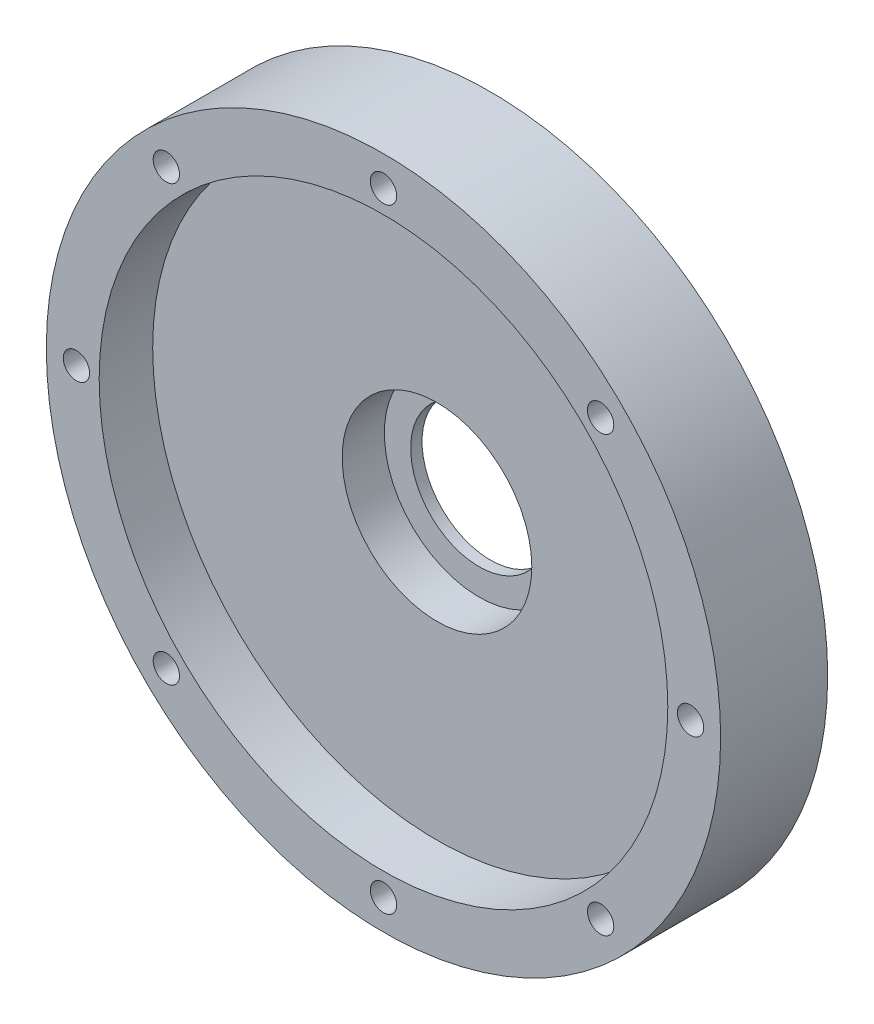
ISO-10303-21;
HEADER;
FILE_DESCRIPTION(('STEP AP214'),'2;1');
FILE_NAME('part.step','',(''),(''),'','','');
FILE_SCHEMA(('AUTOMOTIVE_DESIGN { 1 0 10303 214 1 1 1 1 }'));
ENDSEC;
DATA;
#1=APPLICATION_CONTEXT('core data for automotive mechanical design processes');
#2=APPLICATION_PROTOCOL_DEFINITION('international standard','automotive_design',2000,#1);
#3=PRODUCT_CONTEXT('',#1,'mechanical');
#4=PRODUCT('Part','Part','',(#3));
#5=PRODUCT_RELATED_PRODUCT_CATEGORY('part','',(#4));
#6=PRODUCT_DEFINITION_FORMATION('','',#4);
#7=PRODUCT_DEFINITION_CONTEXT('part definition',#1,'design');
#8=PRODUCT_DEFINITION('design','',#6,#7);
#9=PRODUCT_DEFINITION_SHAPE('','',#8);
#10=(LENGTH_UNIT() NAMED_UNIT(*) SI_UNIT(.MILLI.,.METRE.));
#11=(NAMED_UNIT(*) PLANE_ANGLE_UNIT() SI_UNIT($,.RADIAN.));
#12=(NAMED_UNIT(*) SI_UNIT($,.STERADIAN.) SOLID_ANGLE_UNIT());
#13=UNCERTAINTY_MEASURE_WITH_UNIT(LENGTH_MEASURE(1.E-05),#10,'distance_accuracy_value','');
#14=(GEOMETRIC_REPRESENTATION_CONTEXT(3) GLOBAL_UNCERTAINTY_ASSIGNED_CONTEXT((#13)) GLOBAL_UNIT_ASSIGNED_CONTEXT((#10,
#11,#12)) REPRESENTATION_CONTEXT('',''));
#15=CARTESIAN_POINT('',(0.,0.,0.));
#16=DIRECTION('',(0.,0.,1.));
#17=DIRECTION('',(1.,0.,0.));
#18=AXIS2_PLACEMENT_3D('',#15,#16,#17);
#19=CARTESIAN_POINT('',(0.,0.,10.16));
#20=DIRECTION('',(0.,0.,-1.));
#21=DIRECTION('',(-1.,0.,0.));
#22=AXIS2_PLACEMENT_3D('',#19,#20,#21);
#23=CYLINDRICAL_SURFACE('',#22,32.004);
#24=CARTESIAN_POINT('',(0.,0.,10.16));
#25=DIRECTION('',(0.,0.,1.));
#26=DIRECTION('',(1.,0.,0.));
#27=AXIS2_PLACEMENT_3D('',#24,#25,#26);
#28=CIRCLE('',#27,32.004);
#29=CARTESIAN_POINT('',(32.004,0.,10.16));
#30=VERTEX_POINT('',#29);
#31=EDGE_CURVE('E10',#30,#30,#28,.T.);
#32=ORIENTED_EDGE('',*,*,#31,.F.);
#33=EDGE_LOOP('',(#32));
#34=FACE_BOUND('',#33,.T.);
#35=CARTESIAN_POINT('',(0.,0.,0.));
#36=DIRECTION('',(0.,0.,1.));
#37=DIRECTION('',(1.,0.,0.));
#38=AXIS2_PLACEMENT_3D('',#35,#36,#37);
#39=CIRCLE('',#38,32.004);
#40=CARTESIAN_POINT('',(32.004,0.,0.));
#41=VERTEX_POINT('',#40);
#42=EDGE_CURVE('E50',#41,#41,#39,.T.);
#43=ORIENTED_EDGE('',*,*,#42,.T.);
#44=EDGE_LOOP('',(#43));
#45=FACE_BOUND('',#44,.T.);
#46=ADVANCED_FACE('F47',(#34,#45),#23,.T.);
#47=CARTESIAN_POINT('',(0.,0.,10.16));
#48=DIRECTION('',(0.,0.,1.));
#49=DIRECTION('',(1.,0.,0.));
#50=AXIS2_PLACEMENT_3D('',#47,#48,#49);
#51=PLANE('',#50);
#52=CARTESIAN_POINT('',(0.,29.1465,10.16));
#53=DIRECTION('',(0.,0.,1.));
#54=DIRECTION('',(1.,0.,0.));
#55=AXIS2_PLACEMENT_3D('',#52,#53,#54);
#56=CIRCLE('',#55,1.24999999999999);
#57=CARTESIAN_POINT('',(1.24999999999999,29.1465,10.16));
#58=VERTEX_POINT('',#57);
#59=EDGE_CURVE('E144',#58,#58,#56,.T.);
#60=ORIENTED_EDGE('',*,*,#59,.F.);
#61=EDGE_LOOP('',(#60));
#62=FACE_BOUND('',#61,.T.);
#63=CARTESIAN_POINT('',(20.6096877978537,20.6096877978537,10.16));
#64=DIRECTION('',(0.,0.,1.));
#65=DIRECTION('',(1.,0.,0.));
#66=AXIS2_PLACEMENT_3D('',#63,#64,#65);
#67=CIRCLE('',#66,1.24999999999999);
#68=CARTESIAN_POINT('',(21.8596877978537,20.6096877978537,10.16));
#69=VERTEX_POINT('',#68);
#70=EDGE_CURVE('E136',#69,#69,#67,.T.);
#71=ORIENTED_EDGE('',*,*,#70,.F.);
#72=EDGE_LOOP('',(#71));
#73=FACE_BOUND('',#72,.T.);
#74=CARTESIAN_POINT('',(29.1465,0.,10.16));
#75=DIRECTION('',(0.,0.,1.));
#76=DIRECTION('',(1.,0.,0.));
#77=AXIS2_PLACEMENT_3D('',#74,#75,#76);
#78=CIRCLE('',#77,1.24999999999999);
#79=CARTESIAN_POINT('',(30.3965,0.,10.16));
#80=VERTEX_POINT('',#79);
#81=EDGE_CURVE('E128',#80,#80,#78,.T.);
#82=ORIENTED_EDGE('',*,*,#81,.F.);
#83=EDGE_LOOP('',(#82));
#84=FACE_BOUND('',#83,.T.);
#85=CARTESIAN_POINT('',(20.6096877978537,-20.6096877978537,10.16));
#86=DIRECTION('',(0.,0.,1.));
#87=DIRECTION('',(1.,0.,0.));
#88=AXIS2_PLACEMENT_3D('',#85,#86,#87);
#89=CIRCLE('',#88,1.24999999999999);
#90=CARTESIAN_POINT('',(21.8596877978537,-20.6096877978537,10.16));
#91=VERTEX_POINT('',#90);
#92=EDGE_CURVE('E120',#91,#91,#89,.T.);
#93=ORIENTED_EDGE('',*,*,#92,.F.);
#94=EDGE_LOOP('',(#93));
#95=FACE_BOUND('',#94,.T.);
#96=CARTESIAN_POINT('',(0.,-29.1465,10.16));
#97=DIRECTION('',(0.,0.,1.));
#98=DIRECTION('',(1.,0.,0.));
#99=AXIS2_PLACEMENT_3D('',#96,#97,#98);
#100=CIRCLE('',#99,1.24999999999999);
#101=CARTESIAN_POINT('',(1.24999999999999,-29.1465,10.16));
#102=VERTEX_POINT('',#101);
#103=EDGE_CURVE('E112',#102,#102,#100,.T.);
#104=ORIENTED_EDGE('',*,*,#103,.F.);
#105=EDGE_LOOP('',(#104));
#106=FACE_BOUND('',#105,.T.);
#107=CARTESIAN_POINT('',(-20.6096877978537,-20.6096877978537,10.16));
#108=DIRECTION('',(0.,0.,1.));
#109=DIRECTION('',(1.,0.,0.));
#110=AXIS2_PLACEMENT_3D('',#107,#108,#109);
#111=CIRCLE('',#110,1.24999999999999);
#112=CARTESIAN_POINT('',(-19.3596877978537,-20.6096877978537,10.16));
#113=VERTEX_POINT('',#112);
#114=EDGE_CURVE('E104',#113,#113,#111,.T.);
#115=ORIENTED_EDGE('',*,*,#114,.F.);
#116=EDGE_LOOP('',(#115));
#117=FACE_BOUND('',#116,.T.);
#118=CARTESIAN_POINT('',(-29.1465,0.,10.16));
#119=DIRECTION('',(0.,0.,1.));
#120=DIRECTION('',(1.,0.,0.));
#121=AXIS2_PLACEMENT_3D('',#118,#119,#120);
#122=CIRCLE('',#121,1.24999999999999);
#123=CARTESIAN_POINT('',(-27.8965,0.,10.16));
#124=VERTEX_POINT('',#123);
#125=EDGE_CURVE('E96',#124,#124,#122,.T.);
#126=ORIENTED_EDGE('',*,*,#125,.F.);
#127=EDGE_LOOP('',(#126));
#128=FACE_BOUND('',#127,.T.);
#129=CARTESIAN_POINT('',(-20.6096877978537,20.6096877978537,10.16));
#130=DIRECTION('',(0.,0.,1.));
#131=DIRECTION('',(1.,0.,0.));
#132=AXIS2_PLACEMENT_3D('',#129,#130,#131);
#133=CIRCLE('',#132,1.24999999999999);
#134=CARTESIAN_POINT('',(-19.3596877978537,20.6096877978537,10.16));
#135=VERTEX_POINT('',#134);
#136=EDGE_CURVE('E88',#135,#135,#133,.T.);
#137=ORIENTED_EDGE('',*,*,#136,.F.);
#138=EDGE_LOOP('',(#137));
#139=FACE_BOUND('',#138,.T.);
#140=CARTESIAN_POINT('',(0.,0.,10.16));
#141=DIRECTION('',(0.,0.,1.));
#142=DIRECTION('',(1.,0.,0.));
#143=AXIS2_PLACEMENT_3D('',#140,#141,#142);
#144=CIRCLE('',#143,26.9875);
#145=CARTESIAN_POINT('',(26.9875,0.,10.16));
#146=VERTEX_POINT('',#145);
#147=EDGE_CURVE('E61',#146,#146,#144,.T.);
#148=ORIENTED_EDGE('',*,*,#147,.F.);
#149=EDGE_LOOP('',(#148));
#150=FACE_BOUND('',#149,.T.);
#151=ORIENTED_EDGE('',*,*,#31,.T.);
#152=EDGE_LOOP('',(#151));
#153=FACE_BOUND('',#152,.T.);
#154=ADVANCED_FACE('F151',(#62,#73,#84,#95,#106,#117,#128,#139,#150,#153),#51,.T.);
#155=CARTESIAN_POINT('',(0.,0.,0.));
#156=DIRECTION('',(0.,0.,1.));
#157=DIRECTION('',(1.,0.,0.));
#158=AXIS2_PLACEMENT_3D('',#155,#156,#157);
#159=PLANE('',#158);
#160=CARTESIAN_POINT('',(0.,29.1465,0.));
#161=DIRECTION('',(0.,0.,1.));
#162=DIRECTION('',(1.,0.,0.));
#163=AXIS2_PLACEMENT_3D('',#160,#161,#162);
#164=CIRCLE('',#163,1.25);
#165=CARTESIAN_POINT('',(1.25,29.1465,0.));
#166=VERTEX_POINT('',#165);
#167=EDGE_CURVE('E140',#166,#166,#164,.T.);
#168=ORIENTED_EDGE('',*,*,#167,.T.);
#169=EDGE_LOOP('',(#168));
#170=FACE_BOUND('',#169,.T.);
#171=CARTESIAN_POINT('',(20.6096877978537,20.6096877978537,0.));
#172=DIRECTION('',(0.,0.,1.));
#173=DIRECTION('',(1.,0.,0.));
#174=AXIS2_PLACEMENT_3D('',#171,#172,#173);
#175=CIRCLE('',#174,1.25);
#176=CARTESIAN_POINT('',(21.8596877978537,20.6096877978537,0.));
#177=VERTEX_POINT('',#176);
#178=EDGE_CURVE('E132',#177,#177,#175,.T.);
#179=ORIENTED_EDGE('',*,*,#178,.T.);
#180=EDGE_LOOP('',(#179));
#181=FACE_BOUND('',#180,.T.);
#182=CARTESIAN_POINT('',(29.1465,0.,0.));
#183=DIRECTION('',(0.,0.,1.));
#184=DIRECTION('',(1.,0.,0.));
#185=AXIS2_PLACEMENT_3D('',#182,#183,#184);
#186=CIRCLE('',#185,1.25);
#187=CARTESIAN_POINT('',(30.3965,0.,0.));
#188=VERTEX_POINT('',#187);
#189=EDGE_CURVE('E124',#188,#188,#186,.T.);
#190=ORIENTED_EDGE('',*,*,#189,.T.);
#191=EDGE_LOOP('',(#190));
#192=FACE_BOUND('',#191,.T.);
#193=CARTESIAN_POINT('',(20.6096877978537,-20.6096877978537,0.));
#194=DIRECTION('',(0.,0.,1.));
#195=DIRECTION('',(1.,0.,0.));
#196=AXIS2_PLACEMENT_3D('',#193,#194,#195);
#197=CIRCLE('',#196,1.25);
#198=CARTESIAN_POINT('',(21.8596877978537,-20.6096877978537,0.));
#199=VERTEX_POINT('',#198);
#200=EDGE_CURVE('E116',#199,#199,#197,.T.);
#201=ORIENTED_EDGE('',*,*,#200,.T.);
#202=EDGE_LOOP('',(#201));
#203=FACE_BOUND('',#202,.T.);
#204=CARTESIAN_POINT('',(0.,-29.1465,0.));
#205=DIRECTION('',(0.,0.,1.));
#206=DIRECTION('',(1.,0.,0.));
#207=AXIS2_PLACEMENT_3D('',#204,#205,#206);
#208=CIRCLE('',#207,1.25);
#209=CARTESIAN_POINT('',(1.25,-29.1465,0.));
#210=VERTEX_POINT('',#209);
#211=EDGE_CURVE('E108',#210,#210,#208,.T.);
#212=ORIENTED_EDGE('',*,*,#211,.T.);
#213=EDGE_LOOP('',(#212));
#214=FACE_BOUND('',#213,.T.);
#215=CARTESIAN_POINT('',(-20.6096877978537,-20.6096877978537,0.));
#216=DIRECTION('',(0.,0.,1.));
#217=DIRECTION('',(1.,0.,0.));
#218=AXIS2_PLACEMENT_3D('',#215,#216,#217);
#219=CIRCLE('',#218,1.25);
#220=CARTESIAN_POINT('',(-19.3596877978537,-20.6096877978537,0.));
#221=VERTEX_POINT('',#220);
#222=EDGE_CURVE('E100',#221,#221,#219,.T.);
#223=ORIENTED_EDGE('',*,*,#222,.T.);
#224=EDGE_LOOP('',(#223));
#225=FACE_BOUND('',#224,.T.);
#226=CARTESIAN_POINT('',(-29.1465,0.,0.));
#227=DIRECTION('',(0.,0.,1.));
#228=DIRECTION('',(1.,0.,0.));
#229=AXIS2_PLACEMENT_3D('',#226,#227,#228);
#230=CIRCLE('',#229,1.25);
#231=CARTESIAN_POINT('',(-27.8965,0.,0.));
#232=VERTEX_POINT('',#231);
#233=EDGE_CURVE('E92',#232,#232,#230,.T.);
#234=ORIENTED_EDGE('',*,*,#233,.T.);
#235=EDGE_LOOP('',(#234));
#236=FACE_BOUND('',#235,.T.);
#237=CARTESIAN_POINT('',(-20.6096877978537,20.6096877978537,0.));
#238=DIRECTION('',(0.,0.,1.));
#239=DIRECTION('',(1.,0.,0.));
#240=AXIS2_PLACEMENT_3D('',#237,#238,#239);
#241=CIRCLE('',#240,1.25);
#242=CARTESIAN_POINT('',(-19.3596877978537,20.6096877978537,0.));
#243=VERTEX_POINT('',#242);
#244=EDGE_CURVE('E81',#243,#243,#241,.T.);
#245=ORIENTED_EDGE('',*,*,#244,.T.);
#246=EDGE_LOOP('',(#245));
#247=FACE_BOUND('',#246,.T.);
#248=CARTESIAN_POINT('',(0.,0.,0.));
#249=DIRECTION('',(0.,0.,1.));
#250=DIRECTION('',(1.,0.,0.));
#251=AXIS2_PLACEMENT_3D('',#248,#249,#250);
#252=CIRCLE('',#251,6.5);
#253=CARTESIAN_POINT('',(6.5,0.,0.));
#254=VERTEX_POINT('',#253);
#255=EDGE_CURVE('E73',#254,#254,#252,.T.);
#256=ORIENTED_EDGE('',*,*,#255,.T.);
#257=EDGE_LOOP('',(#256));
#258=FACE_BOUND('',#257,.T.);
#259=ORIENTED_EDGE('',*,*,#42,.F.);
#260=EDGE_LOOP('',(#259));
#261=FACE_BOUND('',#260,.T.);
#262=ADVANCED_FACE('F154',(#170,#181,#192,#203,#214,#225,#236,#247,#258,#261),#159,.F.);
#263=CARTESIAN_POINT('',(0.,0.,5.08));
#264=DIRECTION('',(0.,0.,1.));
#265=DIRECTION('',(1.,0.,0.));
#266=AXIS2_PLACEMENT_3D('',#263,#264,#265);
#267=CYLINDRICAL_SURFACE('',#266,26.9875);
#268=CARTESIAN_POINT('',(0.,0.,5.08));
#269=DIRECTION('',(0.,0.,1.));
#270=DIRECTION('',(1.,0.,0.));
#271=AXIS2_PLACEMENT_3D('',#268,#269,#270);
#272=CIRCLE('',#271,26.9875);
#273=CARTESIAN_POINT('',(26.9875,0.,5.08));
#274=VERTEX_POINT('',#273);
#275=EDGE_CURVE('E59',#274,#274,#272,.T.);
#276=ORIENTED_EDGE('',*,*,#275,.F.);
#277=EDGE_LOOP('',(#276));
#278=FACE_BOUND('',#277,.T.);
#279=ORIENTED_EDGE('',*,*,#147,.T.);
#280=EDGE_LOOP('',(#279));
#281=FACE_BOUND('',#280,.T.);
#282=ADVANCED_FACE('F172',(#278,#281),#267,.F.);
#283=CARTESIAN_POINT('',(0.,0.,5.08));
#284=DIRECTION('',(0.,0.,1.));
#285=DIRECTION('',(1.,0.,0.));
#286=AXIS2_PLACEMENT_3D('',#283,#284,#285);
#287=PLANE('',#286);
#288=CARTESIAN_POINT('',(0.,0.,5.08));
#289=DIRECTION('',(0.,0.,1.));
#290=DIRECTION('',(1.,0.,0.));
#291=AXIS2_PLACEMENT_3D('',#288,#289,#290);
#292=CIRCLE('',#291,9.);
#293=CARTESIAN_POINT('',(9.,0.,5.08));
#294=VERTEX_POINT('',#293);
#295=EDGE_CURVE('E69',#294,#294,#292,.T.);
#296=ORIENTED_EDGE('',*,*,#295,.F.);
#297=EDGE_LOOP('',(#296));
#298=FACE_BOUND('',#297,.T.);
#299=ORIENTED_EDGE('',*,*,#275,.T.);
#300=EDGE_LOOP('',(#299));
#301=FACE_BOUND('',#300,.T.);
#302=ADVANCED_FACE('F174',(#298,#301),#287,.T.);
#303=CARTESIAN_POINT('',(0.,0.,1.08));
#304=DIRECTION('',(0.,0.,1.));
#305=DIRECTION('',(1.,0.,0.));
#306=AXIS2_PLACEMENT_3D('',#303,#304,#305);
#307=CYLINDRICAL_SURFACE('',#306,9.);
#308=CARTESIAN_POINT('',(0.,0.,1.08));
#309=DIRECTION('',(0.,0.,1.));
#310=DIRECTION('',(1.,0.,0.));
#311=AXIS2_PLACEMENT_3D('',#308,#309,#310);
#312=CIRCLE('',#311,9.);
#313=CARTESIAN_POINT('',(9.,0.,1.08));
#314=VERTEX_POINT('',#313);
#315=EDGE_CURVE('E65',#314,#314,#312,.T.);
#316=ORIENTED_EDGE('',*,*,#315,.F.);
#317=EDGE_LOOP('',(#316));
#318=FACE_BOUND('',#317,.T.);
#319=ORIENTED_EDGE('',*,*,#295,.T.);
#320=EDGE_LOOP('',(#319));
#321=FACE_BOUND('',#320,.T.);
#322=ADVANCED_FACE('F181',(#318,#321),#307,.F.);
#323=CARTESIAN_POINT('',(0.,0.,1.08));
#324=DIRECTION('',(0.,0.,1.));
#325=DIRECTION('',(1.,0.,0.));
#326=AXIS2_PLACEMENT_3D('',#323,#324,#325);
#327=PLANE('',#326);
#328=CARTESIAN_POINT('',(0.,0.,1.08));
#329=DIRECTION('',(0.,0.,1.));
#330=DIRECTION('',(1.,0.,0.));
#331=AXIS2_PLACEMENT_3D('',#328,#329,#330);
#332=CIRCLE('',#331,6.5);
#333=CARTESIAN_POINT('',(6.5,0.,1.08));
#334=VERTEX_POINT('',#333);
#335=EDGE_CURVE('E77',#334,#334,#332,.T.);
#336=ORIENTED_EDGE('',*,*,#335,.F.);
#337=EDGE_LOOP('',(#336));
#338=FACE_BOUND('',#337,.T.);
#339=ORIENTED_EDGE('',*,*,#315,.T.);
#340=EDGE_LOOP('',(#339));
#341=FACE_BOUND('',#340,.T.);
#342=ADVANCED_FACE('F229',(#338,#341),#327,.T.);
#343=CARTESIAN_POINT('',(0.,0.,0.));
#344=DIRECTION('',(0.,0.,1.));
#345=DIRECTION('',(1.,0.,0.));
#346=AXIS2_PLACEMENT_3D('',#343,#344,#345);
#347=CYLINDRICAL_SURFACE('',#346,6.5);
#348=ORIENTED_EDGE('',*,*,#255,.F.);
#349=EDGE_LOOP('',(#348));
#350=FACE_BOUND('',#349,.T.);
#351=ORIENTED_EDGE('',*,*,#335,.T.);
#352=EDGE_LOOP('',(#351));
#353=FACE_BOUND('',#352,.T.);
#354=ADVANCED_FACE('F239',(#350,#353),#347,.F.);
#355=CARTESIAN_POINT('',(-20.6096877978537,20.6096877978537,10.16));
#356=DIRECTION('',(0.,0.,1.));
#357=DIRECTION('',(1.,0.,0.));
#358=AXIS2_PLACEMENT_3D('',#355,#356,#357);
#359=CYLINDRICAL_SURFACE('',#358,1.24999999999999);
#360=ORIENTED_EDGE('',*,*,#244,.F.);
#361=EDGE_LOOP('',(#360));
#362=FACE_BOUND('',#361,.T.);
#363=ORIENTED_EDGE('',*,*,#136,.T.);
#364=EDGE_LOOP('',(#363));
#365=FACE_BOUND('',#364,.T.);
#366=ADVANCED_FACE('F248',(#362,#365),#359,.F.);
#367=CARTESIAN_POINT('',(-29.1465,0.,10.16));
#368=DIRECTION('',(0.,0.,1.));
#369=DIRECTION('',(1.,0.,0.));
#370=AXIS2_PLACEMENT_3D('',#367,#368,#369);
#371=CYLINDRICAL_SURFACE('',#370,1.24999999999999);
#372=ORIENTED_EDGE('',*,*,#233,.F.);
#373=EDGE_LOOP('',(#372));
#374=FACE_BOUND('',#373,.T.);
#375=ORIENTED_EDGE('',*,*,#125,.T.);
#376=EDGE_LOOP('',(#375));
#377=FACE_BOUND('',#376,.T.);
#378=ADVANCED_FACE('F258',(#374,#377),#371,.F.);
#379=CARTESIAN_POINT('',(-20.6096877978537,-20.6096877978537,10.16));
#380=DIRECTION('',(0.,0.,1.));
#381=DIRECTION('',(1.,0.,0.));
#382=AXIS2_PLACEMENT_3D('',#379,#380,#381);
#383=CYLINDRICAL_SURFACE('',#382,1.24999999999999);
#384=ORIENTED_EDGE('',*,*,#222,.F.);
#385=EDGE_LOOP('',(#384));
#386=FACE_BOUND('',#385,.T.);
#387=ORIENTED_EDGE('',*,*,#114,.T.);
#388=EDGE_LOOP('',(#387));
#389=FACE_BOUND('',#388,.T.);
#390=ADVANCED_FACE('F270',(#386,#389),#383,.F.);
#391=CARTESIAN_POINT('',(0.,-29.1465,10.16));
#392=DIRECTION('',(0.,0.,1.));
#393=DIRECTION('',(1.,0.,0.));
#394=AXIS2_PLACEMENT_3D('',#391,#392,#393);
#395=CYLINDRICAL_SURFACE('',#394,1.24999999999999);
#396=ORIENTED_EDGE('',*,*,#211,.F.);
#397=EDGE_LOOP('',(#396));
#398=FACE_BOUND('',#397,.T.);
#399=ORIENTED_EDGE('',*,*,#103,.T.);
#400=EDGE_LOOP('',(#399));
#401=FACE_BOUND('',#400,.T.);
#402=ADVANCED_FACE('F282',(#398,#401),#395,.F.);
#403=CARTESIAN_POINT('',(20.6096877978537,-20.6096877978537,10.16));
#404=DIRECTION('',(0.,0.,1.));
#405=DIRECTION('',(1.,0.,0.));
#406=AXIS2_PLACEMENT_3D('',#403,#404,#405);
#407=CYLINDRICAL_SURFACE('',#406,1.24999999999999);
#408=ORIENTED_EDGE('',*,*,#200,.F.);
#409=EDGE_LOOP('',(#408));
#410=FACE_BOUND('',#409,.T.);
#411=ORIENTED_EDGE('',*,*,#92,.T.);
#412=EDGE_LOOP('',(#411));
#413=FACE_BOUND('',#412,.T.);
#414=ADVANCED_FACE('F294',(#410,#413),#407,.F.);
#415=CARTESIAN_POINT('',(29.1465,0.,10.16));
#416=DIRECTION('',(0.,0.,1.));
#417=DIRECTION('',(1.,0.,0.));
#418=AXIS2_PLACEMENT_3D('',#415,#416,#417);
#419=CYLINDRICAL_SURFACE('',#418,1.24999999999999);
#420=ORIENTED_EDGE('',*,*,#189,.F.);
#421=EDGE_LOOP('',(#420));
#422=FACE_BOUND('',#421,.T.);
#423=ORIENTED_EDGE('',*,*,#81,.T.);
#424=EDGE_LOOP('',(#423));
#425=FACE_BOUND('',#424,.T.);
#426=ADVANCED_FACE('F306',(#422,#425),#419,.F.);
#427=CARTESIAN_POINT('',(20.6096877978537,20.6096877978537,10.16));
#428=DIRECTION('',(0.,0.,1.));
#429=DIRECTION('',(1.,0.,0.));
#430=AXIS2_PLACEMENT_3D('',#427,#428,#429);
#431=CYLINDRICAL_SURFACE('',#430,1.24999999999999);
#432=ORIENTED_EDGE('',*,*,#178,.F.);
#433=EDGE_LOOP('',(#432));
#434=FACE_BOUND('',#433,.T.);
#435=ORIENTED_EDGE('',*,*,#70,.T.);
#436=EDGE_LOOP('',(#435));
#437=FACE_BOUND('',#436,.T.);
#438=ADVANCED_FACE('F318',(#434,#437),#431,.F.);
#439=CARTESIAN_POINT('',(0.,29.1465,10.16));
#440=DIRECTION('',(0.,0.,1.));
#441=DIRECTION('',(1.,0.,0.));
#442=AXIS2_PLACEMENT_3D('',#439,#440,#441);
#443=CYLINDRICAL_SURFACE('',#442,1.24999999999999);
#444=ORIENTED_EDGE('',*,*,#167,.F.);
#445=EDGE_LOOP('',(#444));
#446=FACE_BOUND('',#445,.T.);
#447=ORIENTED_EDGE('',*,*,#59,.T.);
#448=EDGE_LOOP('',(#447));
#449=FACE_BOUND('',#448,.T.);
#450=ADVANCED_FACE('F149',(#446,#449),#443,.F.);
#451=CLOSED_SHELL('',(#46,#154,#262,#282,#302,#322,#342,#354,#366,#378,#390,#402,#414,#426,#438,#450));
#452=MANIFOLD_SOLID_BREP('B2',#451);
#453=ADVANCED_BREP_SHAPE_REPRESENTATION('',(#18,#452),#14);
#454=SHAPE_DEFINITION_REPRESENTATION(#9,#453);
ENDSEC;
END-ISO-10303-21;
